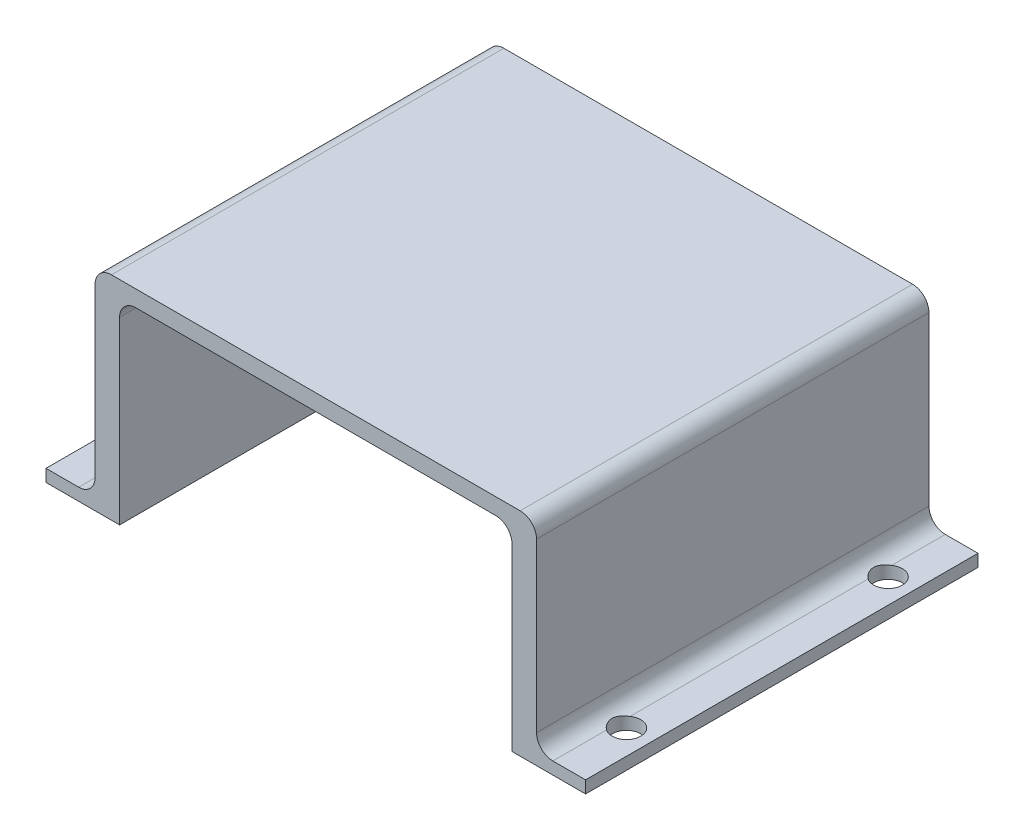
ISO-10303-21;
HEADER;
FILE_DESCRIPTION(('STEP AP214'),'2;1');
FILE_NAME('part.step','',(''),(''),'','','');
FILE_SCHEMA(('AUTOMOTIVE_DESIGN { 1 0 10303 214 1 1 1 1 }'));
ENDSEC;
DATA;
#1=APPLICATION_CONTEXT('core data for automotive mechanical design processes');
#2=APPLICATION_PROTOCOL_DEFINITION('international standard','automotive_design',2000,#1);
#3=PRODUCT_CONTEXT('',#1,'mechanical');
#4=PRODUCT('Part','Part','',(#3));
#5=PRODUCT_RELATED_PRODUCT_CATEGORY('part','',(#4));
#6=PRODUCT_DEFINITION_FORMATION('','',#4);
#7=PRODUCT_DEFINITION_CONTEXT('part definition',#1,'design');
#8=PRODUCT_DEFINITION('design','',#6,#7);
#9=PRODUCT_DEFINITION_SHAPE('','',#8);
#10=(LENGTH_UNIT() NAMED_UNIT(*) SI_UNIT(.MILLI.,.METRE.));
#11=(NAMED_UNIT(*) PLANE_ANGLE_UNIT() SI_UNIT($,.RADIAN.));
#12=(NAMED_UNIT(*) SI_UNIT($,.STERADIAN.) SOLID_ANGLE_UNIT());
#13=UNCERTAINTY_MEASURE_WITH_UNIT(LENGTH_MEASURE(1.E-05),#10,'distance_accuracy_value','');
#14=(GEOMETRIC_REPRESENTATION_CONTEXT(3) GLOBAL_UNCERTAINTY_ASSIGNED_CONTEXT((#13)) GLOBAL_UNIT_ASSIGNED_CONTEXT((#10,
#11,#12)) REPRESENTATION_CONTEXT('',''));
#15=CARTESIAN_POINT('',(0.,0.,0.));
#16=DIRECTION('',(0.,0.,1.));
#17=DIRECTION('',(1.,0.,0.));
#18=AXIS2_PLACEMENT_3D('',#15,#16,#17);
#19=CARTESIAN_POINT('',(0.,0.,76.2));
#20=DIRECTION('',(1.,0.,0.));
#21=DIRECTION('',(0.,0.,-1.));
#22=AXIS2_PLACEMENT_3D('',#19,#20,#21);
#23=PLANE('',#22);
#24=DIRECTION('',(0.,-1.,0.));
#25=VECTOR('',#24,1.);
#26=CARTESIAN_POINT('',(0.,0.,0.));
#27=LINE('',#26,#25);
#28=CARTESIAN_POINT('',(0.,2.38125,0.));
#29=VERTEX_POINT('',#28);
#30=CARTESIAN_POINT('',(0.,0.,0.));
#31=VERTEX_POINT('',#30);
#32=EDGE_CURVE('E345',#29,#31,#27,.T.);
#33=ORIENTED_EDGE('',*,*,#32,.T.);
#34=DIRECTION('',(0.,0.,-1.));
#35=VECTOR('',#34,1.);
#36=CARTESIAN_POINT('',(0.,0.,76.2));
#37=LINE('',#36,#35);
#38=CARTESIAN_POINT('',(0.,0.,76.2));
#39=VERTEX_POINT('',#38);
#40=EDGE_CURVE('E389',#39,#31,#37,.T.);
#41=ORIENTED_EDGE('',*,*,#40,.F.);
#42=DIRECTION('',(0.,-1.,0.));
#43=VECTOR('',#42,1.);
#44=CARTESIAN_POINT('',(0.,0.,76.2));
#45=LINE('',#44,#43);
#46=CARTESIAN_POINT('',(0.,2.38125,76.2));
#47=VERTEX_POINT('',#46);
#48=EDGE_CURVE('E376',#47,#39,#45,.T.);
#49=ORIENTED_EDGE('',*,*,#48,.F.);
#50=DIRECTION('',(0.,0.,-1.));
#51=VECTOR('',#50,1.);
#52=CARTESIAN_POINT('',(0.,2.38125,76.2));
#53=LINE('',#52,#51);
#54=EDGE_CURVE('E344',#47,#29,#53,.T.);
#55=ORIENTED_EDGE('',*,*,#54,.T.);
#56=EDGE_LOOP('',(#33,#41,#49,#55));
#57=FACE_BOUND('',#56,.T.);
#58=ADVANCED_FACE('F35',(#57),#23,.F.);
#59=CARTESIAN_POINT('',(0.,0.,76.2));
#60=DIRECTION('',(0.,1.,0.));
#61=DIRECTION('',(0.,0.,1.));
#62=AXIS2_PLACEMENT_3D('',#59,#60,#61);
#63=PLANE('',#62);
#64=CARTESIAN_POINT('',(4.7625,0.,12.7));
#65=DIRECTION('',(0.,1.,0.));
#66=DIRECTION('',(0.,0.,1.));
#67=AXIS2_PLACEMENT_3D('',#64,#65,#66);
#68=CIRCLE('',#67,2.778125);
#69=CARTESIAN_POINT('',(4.7625,0.,15.478125));
#70=VERTEX_POINT('',#69);
#71=EDGE_CURVE('E488',#70,#70,#68,.T.);
#72=ORIENTED_EDGE('',*,*,#71,.T.);
#73=EDGE_LOOP('',(#72));
#74=FACE_BOUND('',#73,.T.);
#75=CARTESIAN_POINT('',(4.7625,0.,63.5));
#76=DIRECTION('',(0.,1.,0.));
#77=DIRECTION('',(0.,0.,1.));
#78=AXIS2_PLACEMENT_3D('',#75,#76,#77);
#79=CIRCLE('',#78,2.778125);
#80=CARTESIAN_POINT('',(4.7625,0.,66.278125));
#81=VERTEX_POINT('',#80);
#82=EDGE_CURVE('E206',#81,#81,#79,.T.);
#83=ORIENTED_EDGE('',*,*,#82,.T.);
#84=EDGE_LOOP('',(#83));
#85=FACE_BOUND('',#84,.T.);
#86=DIRECTION('',(1.,0.,0.));
#87=VECTOR('',#86,1.);
#88=CARTESIAN_POINT('',(0.,0.,0.));
#89=LINE('',#88,#87);
#90=CARTESIAN_POINT('',(14.2875,0.,0.));
#91=VERTEX_POINT('',#90);
#92=EDGE_CURVE('E347',#31,#91,#89,.T.);
#93=ORIENTED_EDGE('',*,*,#92,.T.);
#94=DIRECTION('',(0.,0.,-1.));
#95=VECTOR('',#94,1.);
#96=CARTESIAN_POINT('',(14.2875,0.,76.2));
#97=LINE('',#96,#95);
#98=CARTESIAN_POINT('',(14.2875,0.,76.2));
#99=VERTEX_POINT('',#98);
#100=EDGE_CURVE('E386',#99,#91,#97,.T.);
#101=ORIENTED_EDGE('',*,*,#100,.F.);
#102=DIRECTION('',(1.,0.,0.));
#103=VECTOR('',#102,1.);
#104=CARTESIAN_POINT('',(0.,0.,76.2));
#105=LINE('',#104,#103);
#106=EDGE_CURVE('E478',#39,#99,#105,.T.);
#107=ORIENTED_EDGE('',*,*,#106,.F.);
#108=ORIENTED_EDGE('',*,*,#40,.T.);
#109=EDGE_LOOP('',(#93,#101,#107,#108));
#110=FACE_BOUND('',#109,.T.);
#111=ADVANCED_FACE('F281',(#74,#85,#110),#63,.F.);
#112=CARTESIAN_POINT('',(14.2875,0.,76.2));
#113=DIRECTION('',(-1.,0.,0.));
#114=DIRECTION('',(0.,0.,1.));
#115=AXIS2_PLACEMENT_3D('',#112,#113,#114);
#116=PLANE('',#115);
#117=DIRECTION('',(0.,1.,0.));
#118=VECTOR('',#117,1.);
#119=CARTESIAN_POINT('',(14.2875,0.,0.));
#120=LINE('',#119,#118);
#121=CARTESIAN_POINT('',(14.2875,34.925,0.));
#122=VERTEX_POINT('',#121);
#123=EDGE_CURVE('E350',#91,#122,#120,.T.);
#124=ORIENTED_EDGE('',*,*,#123,.T.);
#125=DIRECTION('',(0.,0.,-1.));
#126=VECTOR('',#125,1.);
#127=CARTESIAN_POINT('',(14.2875,34.925,76.2));
#128=LINE('',#127,#126);
#129=CARTESIAN_POINT('',(14.2875,34.925,76.2));
#130=VERTEX_POINT('',#129);
#131=EDGE_CURVE('E397',#122,#130,#128,.F.);
#132=ORIENTED_EDGE('',*,*,#131,.T.);
#133=DIRECTION('',(0.,1.,0.));
#134=VECTOR('',#133,1.);
#135=CARTESIAN_POINT('',(14.2875,0.,76.2));
#136=LINE('',#135,#134);
#137=EDGE_CURVE('E326',#99,#130,#136,.T.);
#138=ORIENTED_EDGE('',*,*,#137,.F.);
#139=ORIENTED_EDGE('',*,*,#100,.T.);
#140=EDGE_LOOP('',(#124,#132,#138,#139));
#141=FACE_BOUND('',#140,.T.);
#142=ADVANCED_FACE('F287',(#141),#116,.F.);
#143=CARTESIAN_POINT('',(14.2875,38.1,76.2));
#144=DIRECTION('',(0.,1.,0.));
#145=DIRECTION('',(0.,0.,1.));
#146=AXIS2_PLACEMENT_3D('',#143,#144,#145);
#147=PLANE('',#146);
#148=DIRECTION('',(1.,0.,0.));
#149=VECTOR('',#148,1.);
#150=CARTESIAN_POINT('',(14.2875,38.1,0.));
#151=LINE('',#150,#149);
#152=CARTESIAN_POINT('',(17.4625,38.1,0.));
#153=VERTEX_POINT('',#152);
#154=CARTESIAN_POINT('',(87.3125,38.1,0.));
#155=VERTEX_POINT('',#154);
#156=EDGE_CURVE('E353',#153,#155,#151,.T.);
#157=ORIENTED_EDGE('',*,*,#156,.T.);
#158=DIRECTION('',(0.,0.,-1.));
#159=VECTOR('',#158,1.);
#160=CARTESIAN_POINT('',(87.3125,38.1,76.2));
#161=LINE('',#160,#159);
#162=CARTESIAN_POINT('',(87.3125,38.1,76.2));
#163=VERTEX_POINT('',#162);
#164=EDGE_CURVE('E305',#155,#163,#161,.F.);
#165=ORIENTED_EDGE('',*,*,#164,.T.);
#166=DIRECTION('',(1.,0.,0.));
#167=VECTOR('',#166,1.);
#168=CARTESIAN_POINT('',(14.2875,38.1,76.2));
#169=LINE('',#168,#167);
#170=CARTESIAN_POINT('',(17.4625,38.1,76.2));
#171=VERTEX_POINT('',#170);
#172=EDGE_CURVE('E315',#171,#163,#169,.T.);
#173=ORIENTED_EDGE('',*,*,#172,.F.);
#174=DIRECTION('',(0.,0.,-1.));
#175=VECTOR('',#174,1.);
#176=CARTESIAN_POINT('',(17.4625,38.1,0.));
#177=LINE('',#176,#175);
#178=EDGE_CURVE('E393',#171,#153,#177,.T.);
#179=ORIENTED_EDGE('',*,*,#178,.T.);
#180=EDGE_LOOP('',(#157,#165,#173,#179));
#181=FACE_BOUND('',#180,.T.);
#182=ADVANCED_FACE('F457',(#181),#147,.F.);
#183=CARTESIAN_POINT('',(90.4875,38.1,76.2));
#184=DIRECTION('',(1.,0.,0.));
#185=DIRECTION('',(0.,1.,0.));
#186=AXIS2_PLACEMENT_3D('',#183,#184,#185);
#187=PLANE('',#186);
#188=DIRECTION('',(0.,-1.,0.));
#189=VECTOR('',#188,1.);
#190=CARTESIAN_POINT('',(90.4875,38.1,76.2));
#191=LINE('',#190,#189);
#192=CARTESIAN_POINT('',(90.4875,34.925,76.2));
#193=VERTEX_POINT('',#192);
#194=CARTESIAN_POINT('',(90.4875,0.,76.2));
#195=VERTEX_POINT('',#194);
#196=EDGE_CURVE('E312',#193,#195,#191,.T.);
#197=ORIENTED_EDGE('',*,*,#196,.F.);
#198=DIRECTION('',(0.,0.,-1.));
#199=VECTOR('',#198,1.);
#200=CARTESIAN_POINT('',(90.4875,34.925,0.));
#201=LINE('',#200,#199);
#202=CARTESIAN_POINT('',(90.4875,34.925,0.));
#203=VERTEX_POINT('',#202);
#204=EDGE_CURVE('E307',#193,#203,#201,.T.);
#205=ORIENTED_EDGE('',*,*,#204,.T.);
#206=DIRECTION('',(0.,-1.,0.));
#207=VECTOR('',#206,1.);
#208=CARTESIAN_POINT('',(90.4875,38.1,0.));
#209=LINE('',#208,#207);
#210=CARTESIAN_POINT('',(90.4875,0.,0.));
#211=VERTEX_POINT('',#210);
#212=EDGE_CURVE('E356',#203,#211,#209,.T.);
#213=ORIENTED_EDGE('',*,*,#212,.T.);
#214=DIRECTION('',(0.,0.,-1.));
#215=VECTOR('',#214,1.);
#216=CARTESIAN_POINT('',(90.4875,0.,76.2));
#217=LINE('',#216,#215);
#218=EDGE_CURVE('E320',#195,#211,#217,.T.);
#219=ORIENTED_EDGE('',*,*,#218,.F.);
#220=EDGE_LOOP('',(#197,#205,#213,#219));
#221=FACE_BOUND('',#220,.T.);
#222=ADVANCED_FACE('F317',(#221),#187,.F.);
#223=CARTESIAN_POINT('',(90.4875,0.,76.2));
#224=DIRECTION('',(0.,1.,0.));
#225=DIRECTION('',(-1.,0.,0.));
#226=AXIS2_PLACEMENT_3D('',#223,#224,#225);
#227=PLANE('',#226);
#228=CARTESIAN_POINT('',(100.0125,0.,63.5));
#229=DIRECTION('',(0.,1.,0.));
#230=DIRECTION('',(-1.,0.,0.));
#231=AXIS2_PLACEMENT_3D('',#228,#229,#230);
#232=CIRCLE('',#231,2.778125);
#233=CARTESIAN_POINT('',(97.234375,0.,63.5));
#234=VERTEX_POINT('',#233);
#235=EDGE_CURVE('E348',#234,#234,#232,.T.);
#236=ORIENTED_EDGE('',*,*,#235,.T.);
#237=EDGE_LOOP('',(#236));
#238=FACE_BOUND('',#237,.T.);
#239=CARTESIAN_POINT('',(100.0125,0.,12.7));
#240=DIRECTION('',(0.,1.,0.));
#241=DIRECTION('',(-1.,0.,0.));
#242=AXIS2_PLACEMENT_3D('',#239,#240,#241);
#243=CIRCLE('',#242,2.778125);
#244=CARTESIAN_POINT('',(97.234375,0.,12.7));
#245=VERTEX_POINT('',#244);
#246=EDGE_CURVE('E484',#245,#245,#243,.T.);
#247=ORIENTED_EDGE('',*,*,#246,.T.);
#248=EDGE_LOOP('',(#247));
#249=FACE_BOUND('',#248,.T.);
#250=DIRECTION('',(1.,0.,0.));
#251=VECTOR('',#250,1.);
#252=CARTESIAN_POINT('',(90.4875,0.,0.));
#253=LINE('',#252,#251);
#254=CARTESIAN_POINT('',(104.775,0.,0.));
#255=VERTEX_POINT('',#254);
#256=EDGE_CURVE('E358',#211,#255,#253,.T.);
#257=ORIENTED_EDGE('',*,*,#256,.T.);
#258=DIRECTION('',(0.,0.,-1.));
#259=VECTOR('',#258,1.);
#260=CARTESIAN_POINT('',(104.775,0.,76.2));
#261=LINE('',#260,#259);
#262=CARTESIAN_POINT('',(104.775,0.,76.2));
#263=VERTEX_POINT('',#262);
#264=EDGE_CURVE('E382',#263,#255,#261,.T.);
#265=ORIENTED_EDGE('',*,*,#264,.F.);
#266=DIRECTION('',(1.,0.,0.));
#267=VECTOR('',#266,1.);
#268=CARTESIAN_POINT('',(90.4875,0.,76.2));
#269=LINE('',#268,#267);
#270=EDGE_CURVE('E322',#195,#263,#269,.T.);
#271=ORIENTED_EDGE('',*,*,#270,.F.);
#272=ORIENTED_EDGE('',*,*,#218,.T.);
#273=EDGE_LOOP('',(#257,#265,#271,#272));
#274=FACE_BOUND('',#273,.T.);
#275=ADVANCED_FACE('F448',(#238,#249,#274),#227,.F.);
#276=CARTESIAN_POINT('',(104.775,0.,76.2));
#277=DIRECTION('',(-1.,0.,0.));
#278=DIRECTION('',(0.,0.,1.));
#279=AXIS2_PLACEMENT_3D('',#276,#277,#278);
#280=PLANE('',#279);
#281=DIRECTION('',(0.,1.,0.));
#282=VECTOR('',#281,1.);
#283=CARTESIAN_POINT('',(104.775,0.,0.));
#284=LINE('',#283,#282);
#285=CARTESIAN_POINT('',(104.775,2.38125,0.));
#286=VERTEX_POINT('',#285);
#287=EDGE_CURVE('E360',#255,#286,#284,.T.);
#288=ORIENTED_EDGE('',*,*,#287,.T.);
#289=DIRECTION('',(0.,0.,-1.));
#290=VECTOR('',#289,1.);
#291=CARTESIAN_POINT('',(104.775,2.38125,76.2));
#292=LINE('',#291,#290);
#293=CARTESIAN_POINT('',(104.775,2.38125,76.2));
#294=VERTEX_POINT('',#293);
#295=EDGE_CURVE('E379',#294,#286,#292,.T.);
#296=ORIENTED_EDGE('',*,*,#295,.F.);
#297=DIRECTION('',(0.,1.,0.));
#298=VECTOR('',#297,1.);
#299=CARTESIAN_POINT('',(104.775,0.,76.2));
#300=LINE('',#299,#298);
#301=EDGE_CURVE('E324',#263,#294,#300,.T.);
#302=ORIENTED_EDGE('',*,*,#301,.F.);
#303=ORIENTED_EDGE('',*,*,#264,.T.);
#304=EDGE_LOOP('',(#288,#296,#302,#303));
#305=FACE_BOUND('',#304,.T.);
#306=ADVANCED_FACE('F444',(#305),#280,.F.);
#307=CARTESIAN_POINT('',(104.775,2.38125,76.2));
#308=DIRECTION('',(0.,-1.,0.));
#309=DIRECTION('',(1.,0.,0.));
#310=AXIS2_PLACEMENT_3D('',#307,#308,#309);
#311=PLANE('',#310);
#312=DIRECTION('',(0.,0.,-1.));
#313=VECTOR('',#312,1.);
#314=CARTESIAN_POINT('',(98.425,2.38125,76.2));
#315=LINE('',#314,#313);
#316=CARTESIAN_POINT('',(98.425,2.38125,14.9798733003448));
#317=VERTEX_POINT('',#316);
#318=CARTESIAN_POINT('',(98.425,2.38125,61.2201266996552));
#319=VERTEX_POINT('',#318);
#320=EDGE_CURVE('E409',#317,#319,#315,.F.);
#321=ORIENTED_EDGE('',*,*,#320,.T.);
#322=CARTESIAN_POINT('',(100.0125,2.38125,63.5));
#323=DIRECTION('',(0.,-1.,0.));
#324=DIRECTION('',(1.,0.,0.));
#325=AXIS2_PLACEMENT_3D('',#322,#323,#324);
#326=CIRCLE('',#325,2.778125);
#327=CARTESIAN_POINT('',(98.425,2.38125,65.7798733003448));
#328=VERTEX_POINT('',#327);
#329=EDGE_CURVE('E54',#319,#328,#326,.T.);
#330=ORIENTED_EDGE('',*,*,#329,.T.);
#331=CARTESIAN_POINT('',(98.425,2.38125,76.2));
#332=VERTEX_POINT('',#331);
#333=EDGE_CURVE('E404',#328,#332,#315,.F.);
#334=ORIENTED_EDGE('',*,*,#333,.T.);
#335=DIRECTION('',(-1.,0.,0.));
#336=VECTOR('',#335,1.);
#337=CARTESIAN_POINT('',(104.775,2.38125,76.2));
#338=LINE('',#337,#336);
#339=EDGE_CURVE('E331',#294,#332,#338,.T.);
#340=ORIENTED_EDGE('',*,*,#339,.F.);
#341=ORIENTED_EDGE('',*,*,#295,.T.);
#342=DIRECTION('',(-1.,0.,0.));
#343=VECTOR('',#342,1.);
#344=CARTESIAN_POINT('',(104.775,2.38125,0.));
#345=LINE('',#344,#343);
#346=CARTESIAN_POINT('',(98.425,2.38125,0.));
#347=VERTEX_POINT('',#346);
#348=EDGE_CURVE('E362',#286,#347,#345,.T.);
#349=ORIENTED_EDGE('',*,*,#348,.T.);
#350=CARTESIAN_POINT('',(98.425,2.38125,10.4201266996552));
#351=VERTEX_POINT('',#350);
#352=EDGE_CURVE('E405',#347,#351,#315,.F.);
#353=ORIENTED_EDGE('',*,*,#352,.T.);
#354=CARTESIAN_POINT('',(100.0125,2.38125,12.7));
#355=DIRECTION('',(0.,-1.,0.));
#356=DIRECTION('',(1.,0.,0.));
#357=AXIS2_PLACEMENT_3D('',#354,#355,#356);
#358=CIRCLE('',#357,2.778125);
#359=EDGE_CURVE('E60',#351,#317,#358,.T.);
#360=ORIENTED_EDGE('',*,*,#359,.T.);
#361=EDGE_LOOP('',(#321,#330,#334,#340,#341,#349,#353,#360));
#362=FACE_BOUND('',#361,.T.);
#363=ADVANCED_FACE('F439',(#362),#311,.F.);
#364=CARTESIAN_POINT('',(95.25,2.38125,76.2));
#365=DIRECTION('',(-1.,0.,0.));
#366=DIRECTION('',(0.,0.,1.));
#367=AXIS2_PLACEMENT_3D('',#364,#365,#366);
#368=PLANE('',#367);
#369=DIRECTION('',(0.,1.,0.));
#370=VECTOR('',#369,1.);
#371=CARTESIAN_POINT('',(95.25,2.38125,76.2));
#372=LINE('',#371,#370);
#373=CARTESIAN_POINT('',(95.25,5.55625,76.2));
#374=VERTEX_POINT('',#373);
#375=CARTESIAN_POINT('',(95.25,38.1,76.2));
#376=VERTEX_POINT('',#375);
#377=EDGE_CURVE('E334',#374,#376,#372,.T.);
#378=ORIENTED_EDGE('',*,*,#377,.F.);
#379=DIRECTION('',(0.,0.,-1.));
#380=VECTOR('',#379,1.);
#381=CARTESIAN_POINT('',(95.25,5.55625,0.));
#382=LINE('',#381,#380);
#383=CARTESIAN_POINT('',(95.25,5.55625,0.));
#384=VERTEX_POINT('',#383);
#385=EDGE_CURVE('E401',#374,#384,#382,.T.);
#386=ORIENTED_EDGE('',*,*,#385,.T.);
#387=DIRECTION('',(0.,1.,0.));
#388=VECTOR('',#387,1.);
#389=CARTESIAN_POINT('',(95.25,2.38125,0.));
#390=LINE('',#389,#388);
#391=CARTESIAN_POINT('',(95.25,38.1,0.));
#392=VERTEX_POINT('',#391);
#393=EDGE_CURVE('E365',#384,#392,#390,.T.);
#394=ORIENTED_EDGE('',*,*,#393,.T.);
#395=DIRECTION('',(0.,0.,-1.));
#396=VECTOR('',#395,1.);
#397=CARTESIAN_POINT('',(95.25,38.1,76.2));
#398=LINE('',#397,#396);
#399=EDGE_CURVE('E399',#392,#376,#398,.F.);
#400=ORIENTED_EDGE('',*,*,#399,.T.);
#401=EDGE_LOOP('',(#378,#386,#394,#400));
#402=FACE_BOUND('',#401,.T.);
#403=ADVANCED_FACE('F430',(#402),#368,.F.);
#404=CARTESIAN_POINT('',(95.25,41.275,76.2));
#405=DIRECTION('',(0.,-1.,0.));
#406=DIRECTION('',(1.,0.,0.));
#407=AXIS2_PLACEMENT_3D('',#404,#405,#406);
#408=PLANE('',#407);
#409=DIRECTION('',(-1.,0.,0.));
#410=VECTOR('',#409,1.);
#411=CARTESIAN_POINT('',(95.25,41.275,76.2));
#412=LINE('',#411,#410);
#413=CARTESIAN_POINT('',(92.075,41.275,76.2));
#414=VERTEX_POINT('',#413);
#415=CARTESIAN_POINT('',(12.7,41.275,76.2));
#416=VERTEX_POINT('',#415);
#417=EDGE_CURVE('E336',#414,#416,#412,.T.);
#418=ORIENTED_EDGE('',*,*,#417,.F.);
#419=DIRECTION('',(0.,0.,-1.));
#420=VECTOR('',#419,1.);
#421=CARTESIAN_POINT('',(92.075,41.275,76.2));
#422=LINE('',#421,#420);
#423=CARTESIAN_POINT('',(92.075,41.275,0.));
#424=VERTEX_POINT('',#423);
#425=EDGE_CURVE('E411',#414,#424,#422,.T.);
#426=ORIENTED_EDGE('',*,*,#425,.T.);
#427=DIRECTION('',(-1.,0.,0.));
#428=VECTOR('',#427,1.);
#429=CARTESIAN_POINT('',(95.25,41.275,0.));
#430=LINE('',#429,#428);
#431=CARTESIAN_POINT('',(12.7,41.275,0.));
#432=VERTEX_POINT('',#431);
#433=EDGE_CURVE('E368',#424,#432,#430,.T.);
#434=ORIENTED_EDGE('',*,*,#433,.T.);
#435=DIRECTION('',(0.,0.,-1.));
#436=VECTOR('',#435,1.);
#437=CARTESIAN_POINT('',(12.7,41.275,76.2));
#438=LINE('',#437,#436);
#439=EDGE_CURVE('E408',#432,#416,#438,.F.);
#440=ORIENTED_EDGE('',*,*,#439,.T.);
#441=EDGE_LOOP('',(#418,#426,#434,#440));
#442=FACE_BOUND('',#441,.T.);
#443=ADVANCED_FACE('F425',(#442),#408,.F.);
#444=CARTESIAN_POINT('',(9.525,41.275,76.2));
#445=DIRECTION('',(1.,0.,0.));
#446=DIRECTION('',(0.,1.,0.));
#447=AXIS2_PLACEMENT_3D('',#444,#445,#446);
#448=PLANE('',#447);
#449=DIRECTION('',(0.,-1.,0.));
#450=VECTOR('',#449,1.);
#451=CARTESIAN_POINT('',(9.525,41.275,0.));
#452=LINE('',#451,#450);
#453=CARTESIAN_POINT('',(9.525,38.1,0.));
#454=VERTEX_POINT('',#453);
#455=CARTESIAN_POINT('',(9.525,5.55625,0.));
#456=VERTEX_POINT('',#455);
#457=EDGE_CURVE('E371',#454,#456,#452,.T.);
#458=ORIENTED_EDGE('',*,*,#457,.T.);
#459=DIRECTION('',(0.,0.,-1.));
#460=VECTOR('',#459,1.);
#461=CARTESIAN_POINT('',(9.525,5.55625,76.2));
#462=LINE('',#461,#460);
#463=CARTESIAN_POINT('',(9.525,5.55625,76.2));
#464=VERTEX_POINT('',#463);
#465=EDGE_CURVE('E220',#456,#464,#462,.F.);
#466=ORIENTED_EDGE('',*,*,#465,.T.);
#467=DIRECTION('',(0.,-1.,0.));
#468=VECTOR('',#467,1.);
#469=CARTESIAN_POINT('',(9.525,41.275,76.2));
#470=LINE('',#469,#468);
#471=CARTESIAN_POINT('',(9.525,38.1,76.2));
#472=VERTEX_POINT('',#471);
#473=EDGE_CURVE('E339',#472,#464,#470,.T.);
#474=ORIENTED_EDGE('',*,*,#473,.F.);
#475=DIRECTION('',(0.,0.,-1.));
#476=VECTOR('',#475,1.);
#477=CARTESIAN_POINT('',(9.525,38.1,76.2));
#478=LINE('',#477,#476);
#479=EDGE_CURVE('E213',#472,#454,#478,.T.);
#480=ORIENTED_EDGE('',*,*,#479,.T.);
#481=EDGE_LOOP('',(#458,#466,#474,#480));
#482=FACE_BOUND('',#481,.T.);
#483=ADVANCED_FACE('F507',(#482),#448,.F.);
#484=CARTESIAN_POINT('',(0.,2.38125,76.2));
#485=DIRECTION('',(0.,-1.,0.));
#486=DIRECTION('',(0.,0.,-1.));
#487=AXIS2_PLACEMENT_3D('',#484,#485,#486);
#488=PLANE('',#487);
#489=DIRECTION('',(0.,0.,-1.));
#490=VECTOR('',#489,1.);
#491=CARTESIAN_POINT('',(6.35,2.38125,0.));
#492=LINE('',#491,#490);
#493=CARTESIAN_POINT('',(6.35,2.38125,61.2201266996552));
#494=VERTEX_POINT('',#493);
#495=CARTESIAN_POINT('',(6.35,2.38125,14.9798733003448));
#496=VERTEX_POINT('',#495);
#497=EDGE_CURVE('E203',#494,#496,#492,.T.);
#498=ORIENTED_EDGE('',*,*,#497,.T.);
#499=CARTESIAN_POINT('',(4.7625,2.38125,12.7));
#500=DIRECTION('',(0.,-1.,0.));
#501=DIRECTION('',(0.,0.,-1.));
#502=AXIS2_PLACEMENT_3D('',#499,#500,#501);
#503=CIRCLE('',#502,2.778125);
#504=CARTESIAN_POINT('',(6.35,2.38125,10.4201266996552));
#505=VERTEX_POINT('',#504);
#506=EDGE_CURVE('E491',#496,#505,#503,.T.);
#507=ORIENTED_EDGE('',*,*,#506,.T.);
#508=CARTESIAN_POINT('',(6.35,2.38125,0.));
#509=VERTEX_POINT('',#508);
#510=EDGE_CURVE('E211',#505,#509,#492,.T.);
#511=ORIENTED_EDGE('',*,*,#510,.T.);
#512=DIRECTION('',(-1.,0.,0.));
#513=VECTOR('',#512,1.);
#514=CARTESIAN_POINT('',(0.,2.38125,0.));
#515=LINE('',#514,#513);
#516=EDGE_CURVE('E374',#509,#29,#515,.T.);
#517=ORIENTED_EDGE('',*,*,#516,.T.);
#518=ORIENTED_EDGE('',*,*,#54,.F.);
#519=DIRECTION('',(-1.,0.,0.));
#520=VECTOR('',#519,1.);
#521=CARTESIAN_POINT('',(0.,2.38125,76.2));
#522=LINE('',#521,#520);
#523=CARTESIAN_POINT('',(6.35,2.38125,76.2));
#524=VERTEX_POINT('',#523);
#525=EDGE_CURVE('E342',#524,#47,#522,.T.);
#526=ORIENTED_EDGE('',*,*,#525,.F.);
#527=CARTESIAN_POINT('',(6.35,2.38125,65.7798733003448));
#528=VERTEX_POINT('',#527);
#529=EDGE_CURVE('E205',#524,#528,#492,.T.);
#530=ORIENTED_EDGE('',*,*,#529,.T.);
#531=CARTESIAN_POINT('',(4.7625,2.38125,63.5));
#532=DIRECTION('',(0.,-1.,0.));
#533=DIRECTION('',(0.,0.,-1.));
#534=AXIS2_PLACEMENT_3D('',#531,#532,#533);
#535=CIRCLE('',#534,2.778125);
#536=EDGE_CURVE('E191',#528,#494,#535,.T.);
#537=ORIENTED_EDGE('',*,*,#536,.T.);
#538=EDGE_LOOP('',(#498,#507,#511,#517,#518,#526,#530,#537));
#539=FACE_BOUND('',#538,.T.);
#540=ADVANCED_FACE('F201',(#539),#488,.F.);
#541=CARTESIAN_POINT('',(0.,0.,76.2));
#542=DIRECTION('',(0.,0.,-1.));
#543=DIRECTION('',(-1.,0.,0.));
#544=AXIS2_PLACEMENT_3D('',#541,#542,#543);
#545=PLANE('',#544);
#546=ORIENTED_EDGE('',*,*,#377,.T.);
#547=CARTESIAN_POINT('',(92.075,38.1,76.2));
#548=DIRECTION('',(0.,0.,-1.));
#549=DIRECTION('',(-1.,0.,0.));
#550=AXIS2_PLACEMENT_3D('',#547,#548,#549);
#551=CIRCLE('',#550,3.175);
#552=EDGE_CURVE('E214',#376,#414,#551,.F.);
#553=ORIENTED_EDGE('',*,*,#552,.T.);
#554=ORIENTED_EDGE('',*,*,#417,.T.);
#555=CARTESIAN_POINT('',(12.7,38.1,76.2));
#556=DIRECTION('',(0.,0.,-1.));
#557=DIRECTION('',(-1.,0.,0.));
#558=AXIS2_PLACEMENT_3D('',#555,#556,#557);
#559=CIRCLE('',#558,3.175);
#560=EDGE_CURVE('E417',#416,#472,#559,.F.);
#561=ORIENTED_EDGE('',*,*,#560,.T.);
#562=ORIENTED_EDGE('',*,*,#473,.T.);
#563=CARTESIAN_POINT('',(6.35,5.55625,76.2));
#564=DIRECTION('',(0.,0.,-1.));
#565=DIRECTION('',(-1.,0.,0.));
#566=AXIS2_PLACEMENT_3D('',#563,#564,#565);
#567=CIRCLE('',#566,3.175);
#568=EDGE_CURVE('E197',#464,#524,#567,.T.);
#569=ORIENTED_EDGE('',*,*,#568,.T.);
#570=ORIENTED_EDGE('',*,*,#525,.T.);
#571=ORIENTED_EDGE('',*,*,#48,.T.);
#572=ORIENTED_EDGE('',*,*,#106,.T.);
#573=ORIENTED_EDGE('',*,*,#137,.T.);
#574=CARTESIAN_POINT('',(17.4625,34.925,76.2));
#575=DIRECTION('',(0.,0.,-1.));
#576=DIRECTION('',(-1.,0.,0.));
#577=AXIS2_PLACEMENT_3D('',#574,#575,#576);
#578=CIRCLE('',#577,3.175);
#579=EDGE_CURVE('E228',#130,#171,#578,.T.);
#580=ORIENTED_EDGE('',*,*,#579,.T.);
#581=ORIENTED_EDGE('',*,*,#172,.T.);
#582=CARTESIAN_POINT('',(87.3125,34.925,76.2));
#583=DIRECTION('',(0.,0.,-1.));
#584=DIRECTION('',(-1.,0.,0.));
#585=AXIS2_PLACEMENT_3D('',#582,#583,#584);
#586=CIRCLE('',#585,3.175);
#587=EDGE_CURVE('E224',#163,#193,#586,.T.);
#588=ORIENTED_EDGE('',*,*,#587,.T.);
#589=ORIENTED_EDGE('',*,*,#196,.T.);
#590=ORIENTED_EDGE('',*,*,#270,.T.);
#591=ORIENTED_EDGE('',*,*,#301,.T.);
#592=ORIENTED_EDGE('',*,*,#339,.T.);
#593=CARTESIAN_POINT('',(98.425,5.55625,76.2));
#594=DIRECTION('',(0.,0.,-1.));
#595=DIRECTION('',(-1.,0.,0.));
#596=AXIS2_PLACEMENT_3D('',#593,#594,#595);
#597=CIRCLE('',#596,3.175);
#598=EDGE_CURVE('E232',#332,#374,#597,.T.);
#599=ORIENTED_EDGE('',*,*,#598,.T.);
#600=EDGE_LOOP('',(#546,#553,#554,#561,#562,#569,#570,#571,#572,#573,#580,#581,#588,#589,#590,
#591,#592,#599));
#601=FACE_BOUND('',#600,.T.);
#602=ADVANCED_FACE('F260',(#601),#545,.F.);
#603=CARTESIAN_POINT('',(0.,0.,0.));
#604=DIRECTION('',(0.,0.,-1.));
#605=DIRECTION('',(-1.,0.,0.));
#606=AXIS2_PLACEMENT_3D('',#603,#604,#605);
#607=PLANE('',#606);
#608=ORIENTED_EDGE('',*,*,#433,.F.);
#609=CARTESIAN_POINT('',(92.075,38.1,0.));
#610=DIRECTION('',(0.,0.,-1.));
#611=DIRECTION('',(-1.,0.,0.));
#612=AXIS2_PLACEMENT_3D('',#609,#610,#611);
#613=CIRCLE('',#612,3.175);
#614=EDGE_CURVE('E416',#424,#392,#613,.T.);
#615=ORIENTED_EDGE('',*,*,#614,.T.);
#616=ORIENTED_EDGE('',*,*,#393,.F.);
#617=CARTESIAN_POINT('',(98.425,5.55625,0.));
#618=DIRECTION('',(0.,0.,-1.));
#619=DIRECTION('',(-1.,0.,0.));
#620=AXIS2_PLACEMENT_3D('',#617,#618,#619);
#621=CIRCLE('',#620,3.175);
#622=EDGE_CURVE('E230',#384,#347,#621,.F.);
#623=ORIENTED_EDGE('',*,*,#622,.T.);
#624=ORIENTED_EDGE('',*,*,#348,.F.);
#625=ORIENTED_EDGE('',*,*,#287,.F.);
#626=ORIENTED_EDGE('',*,*,#256,.F.);
#627=ORIENTED_EDGE('',*,*,#212,.F.);
#628=CARTESIAN_POINT('',(87.3125,34.925,0.));
#629=DIRECTION('',(0.,0.,-1.));
#630=DIRECTION('',(-1.,0.,0.));
#631=AXIS2_PLACEMENT_3D('',#628,#629,#630);
#632=CIRCLE('',#631,3.175);
#633=EDGE_CURVE('E222',#203,#155,#632,.F.);
#634=ORIENTED_EDGE('',*,*,#633,.T.);
#635=ORIENTED_EDGE('',*,*,#156,.F.);
#636=CARTESIAN_POINT('',(17.4625,34.925,0.));
#637=DIRECTION('',(0.,0.,-1.));
#638=DIRECTION('',(-1.,0.,0.));
#639=AXIS2_PLACEMENT_3D('',#636,#637,#638);
#640=CIRCLE('',#639,3.175);
#641=EDGE_CURVE('E226',#153,#122,#640,.F.);
#642=ORIENTED_EDGE('',*,*,#641,.T.);
#643=ORIENTED_EDGE('',*,*,#123,.F.);
#644=ORIENTED_EDGE('',*,*,#92,.F.);
#645=ORIENTED_EDGE('',*,*,#32,.F.);
#646=ORIENTED_EDGE('',*,*,#516,.F.);
#647=CARTESIAN_POINT('',(6.35,5.55625,0.));
#648=DIRECTION('',(0.,0.,-1.));
#649=DIRECTION('',(-1.,0.,0.));
#650=AXIS2_PLACEMENT_3D('',#647,#648,#649);
#651=CIRCLE('',#650,3.175);
#652=EDGE_CURVE('E234',#509,#456,#651,.F.);
#653=ORIENTED_EDGE('',*,*,#652,.T.);
#654=ORIENTED_EDGE('',*,*,#457,.F.);
#655=CARTESIAN_POINT('',(12.7,38.1,0.));
#656=DIRECTION('',(0.,0.,-1.));
#657=DIRECTION('',(-1.,0.,0.));
#658=AXIS2_PLACEMENT_3D('',#655,#656,#657);
#659=CIRCLE('',#658,3.175);
#660=EDGE_CURVE('E414',#454,#432,#659,.T.);
#661=ORIENTED_EDGE('',*,*,#660,.T.);
#662=EDGE_LOOP('',(#608,#615,#616,#623,#624,#625,#626,#627,#634,#635,#642,#643,#644,#645,#646,
#653,#654,#661));
#663=FACE_BOUND('',#662,.T.);
#664=ADVANCED_FACE('F294',(#663),#607,.T.);
#665=CARTESIAN_POINT('',(87.3125,34.925,76.2));
#666=DIRECTION('',(0.,0.,1.));
#667=DIRECTION('',(1.,0.,0.));
#668=AXIS2_PLACEMENT_3D('',#665,#666,#667);
#669=CYLINDRICAL_SURFACE('',#668,3.175);
#670=ORIENTED_EDGE('',*,*,#587,.F.);
#671=ORIENTED_EDGE('',*,*,#164,.F.);
#672=ORIENTED_EDGE('',*,*,#633,.F.);
#673=ORIENTED_EDGE('',*,*,#204,.F.);
#674=EDGE_LOOP('',(#670,#671,#672,#673));
#675=FACE_BOUND('',#674,.T.);
#676=ADVANCED_FACE('F292',(#675),#669,.F.);
#677=CARTESIAN_POINT('',(17.4625,34.925,76.2));
#678=DIRECTION('',(0.,0.,1.));
#679=DIRECTION('',(1.,0.,0.));
#680=AXIS2_PLACEMENT_3D('',#677,#678,#679);
#681=CYLINDRICAL_SURFACE('',#680,3.175);
#682=ORIENTED_EDGE('',*,*,#579,.F.);
#683=ORIENTED_EDGE('',*,*,#131,.F.);
#684=ORIENTED_EDGE('',*,*,#641,.F.);
#685=ORIENTED_EDGE('',*,*,#178,.F.);
#686=EDGE_LOOP('',(#682,#683,#684,#685));
#687=FACE_BOUND('',#686,.T.);
#688=ADVANCED_FACE('F270',(#687),#681,.F.);
#689=CARTESIAN_POINT('',(98.425,5.55625,76.2));
#690=DIRECTION('',(0.,0.,1.));
#691=DIRECTION('',(1.,0.,0.));
#692=AXIS2_PLACEMENT_3D('',#689,#690,#691);
#693=CYLINDRICAL_SURFACE('',#692,3.175);
#694=ORIENTED_EDGE('',*,*,#333,.F.);
#695=CARTESIAN_POINT('',(98.425,2.38125,65.7798733003448));
#696=CARTESIAN_POINT('',(98.3624489926485,2.38124502199424,65.7363321245006));
#697=CARTESIAN_POINT('',(98.3017322303486,2.38309804994742,65.6902197109771));
#698=CARTESIAN_POINT('',(98.184432268252,2.38983384564999,65.5933018999807));
#699=CARTESIAN_POINT('',(98.1278454163736,2.39471389940968,65.5425007410642));
#700=CARTESIAN_POINT('',(98.0193024207807,2.4068037016709,65.4367173582443));
#701=CARTESIAN_POINT('',(97.96733428063,2.41400717558616,65.3817466968207));
#702=CARTESIAN_POINT('',(97.868154933093,2.43005858086851,65.2678989621292));
#703=CARTESIAN_POINT('',(97.8209447793166,2.43890687523668,65.2090210283998));
#704=CARTESIAN_POINT('',(97.6871038219786,2.46684469491917,65.0274352741283));
#705=CARTESIAN_POINT('',(97.607869365919,2.4873803235839,64.8993906703489));
#706=CARTESIAN_POINT('',(97.4709860036099,2.52712437069266,64.6319266454302));
#707=CARTESIAN_POINT('',(97.4133510617319,2.54633192399795,64.4924999362921));
#708=CARTESIAN_POINT('',(97.3432231507197,2.57111677931778,64.2740587545186));
#709=CARTESIAN_POINT('',(97.3223053782528,2.57882815850023,64.1979090980219));
#710=CARTESIAN_POINT('',(97.287002191366,2.59214026859064,64.0439401548763));
#711=CARTESIAN_POINT('',(97.2726142449898,2.59774181744702,63.9661215276538));
#712=CARTESIAN_POINT('',(97.2505303487237,2.60643829314347,63.8094435279201));
#713=CARTESIAN_POINT('',(97.2428305209971,2.60953467243392,63.7305847854429));
#714=CARTESIAN_POINT('',(97.2341899512417,2.6130189641069,63.5724617797592));
#715=CARTESIAN_POINT('',(97.2332487369621,2.61340706572734,63.4931975452733));
#716=CARTESIAN_POINT('',(97.2402893399155,2.61054497764216,63.2663190805623));
#717=CARTESIAN_POINT('',(97.2566972011995,2.60385589732818,63.1189116366899));
#718=CARTESIAN_POINT('',(97.3125372779258,2.58237980045341,62.8291678683077));
#719=CARTESIAN_POINT('',(97.3519853509499,2.56758720703055,62.6868351081414));
#720=CARTESIAN_POINT('',(97.4529618762006,2.53323589966773,62.4097563475591));
#721=CARTESIAN_POINT('',(97.5146394412628,2.51364529266191,62.2750688681231));
#722=CARTESIAN_POINT('',(97.6584863018631,2.47426551584966,62.0173066659403));
#723=CARTESIAN_POINT('',(97.7406400907546,2.45447650712785,61.8942232522086));
#724=CARTESIAN_POINT('',(97.9162497356903,2.42111298992168,61.671874415548));
#725=CARTESIAN_POINT('',(98.0081904103072,2.40715770025353,61.5714785335799));
#726=CARTESIAN_POINT('',(98.1567625689363,2.39220791436953,61.4314561310547));
#727=CARTESIAN_POINT('',(98.2081400706107,2.38822052151454,61.3864903738157));
#728=CARTESIAN_POINT('',(98.3141816518071,2.38273968490741,61.3003716788447));
#729=CARTESIAN_POINT('',(98.3688481381899,2.38124809114062,61.2592215907599));
#730=CARTESIAN_POINT('',(98.425,2.38125,61.2201266996552));
#731=B_SPLINE_CURVE_WITH_KNOTS('',3,(#695,#696,#697,#698,#699,#700,#701,#702,#703,#704,#705,
#706,#707,#708,#709,#710,#711,#712,#713,#714,#715,#716,#717,#718,#719,#720,#721,#722,#723,#724,
#725,#726,#727,#728,#729,#730),.UNSPECIFIED.,.F.,.F.,(4,2,2,2,2,2,2,2,2,2,2,2,2,2,2,2,2,4),(0.,
0.22849924185729,0.45679390997516,0.68447714047554,0.912210678955064,1.36603972488336,
1.82016167319418,2.05793150218368,2.29560905639513,2.53314871066593,2.77067176695067,
3.21372839170438,3.65709031311518,4.10348336138239,4.54953937785754,4.95837357214384,
5.16334481479638,5.36846792307332),.UNSPECIFIED.);
#732=EDGE_CURVE('E11',#328,#319,#731,.T.);
#733=ORIENTED_EDGE('',*,*,#732,.T.);
#734=ORIENTED_EDGE('',*,*,#320,.F.);
#735=CARTESIAN_POINT('',(98.425,2.38125,14.9798733003448));
#736=CARTESIAN_POINT('',(98.3624489926485,2.38124502199424,14.9363321245006));
#737=CARTESIAN_POINT('',(98.3017322303486,2.38309804994742,14.8902197109771));
#738=CARTESIAN_POINT('',(98.184432268252,2.38983384564999,14.7933018999807));
#739=CARTESIAN_POINT('',(98.1278454163737,2.39471389940968,14.7425007410643));
#740=CARTESIAN_POINT('',(98.0193024207807,2.4068037016709,14.6367173582443));
#741=CARTESIAN_POINT('',(97.9673342806301,2.41400717558616,14.5817466968207));
#742=CARTESIAN_POINT('',(97.868154933093,2.43005858086851,14.4678989621292));
#743=CARTESIAN_POINT('',(97.8209447793167,2.43890687523668,14.4090210283998));
#744=CARTESIAN_POINT('',(97.6871038219786,2.46684469491917,14.2274352741284));
#745=CARTESIAN_POINT('',(97.607869365919,2.48738032358389,14.0993906703489));
#746=CARTESIAN_POINT('',(97.4709860036099,2.52712437069265,13.8319266454302));
#747=CARTESIAN_POINT('',(97.4133510617319,2.54633192399795,13.6924999362921));
#748=CARTESIAN_POINT('',(97.3432231507198,2.57111677931778,13.4740587545186));
#749=CARTESIAN_POINT('',(97.3223053782528,2.57882815850023,13.397909098022));
#750=CARTESIAN_POINT('',(97.287002191366,2.59214026859064,13.2439401548764));
#751=CARTESIAN_POINT('',(97.2726142449898,2.59774181744702,13.1661215276538));
#752=CARTESIAN_POINT('',(97.2505303487237,2.60643829314347,13.0094435279201));
#753=CARTESIAN_POINT('',(97.2428305209971,2.60953467243391,12.9305847854429));
#754=CARTESIAN_POINT('',(97.2341899512417,2.6130189641069,12.7724617797592));
#755=CARTESIAN_POINT('',(97.2332487369621,2.61340706572734,12.6931975452733));
#756=CARTESIAN_POINT('',(97.2402893399154,2.61054497764216,12.4663190805623));
#757=CARTESIAN_POINT('',(97.2566972011995,2.60385589732819,12.31891163669));
#758=CARTESIAN_POINT('',(97.3125372779258,2.58237980045341,12.0291678683078));
#759=CARTESIAN_POINT('',(97.3519853509498,2.56758720703055,11.8868351081414));
#760=CARTESIAN_POINT('',(97.4529618762006,2.53323589966773,11.6097563475591));
#761=CARTESIAN_POINT('',(97.5146394412628,2.51364529266191,11.4750688681231));
#762=CARTESIAN_POINT('',(97.6584863018631,2.47426551584966,11.2173066659403));
#763=CARTESIAN_POINT('',(97.7406400907546,2.45447650712786,11.0942232522086));
#764=CARTESIAN_POINT('',(97.9162497356903,2.42111298992168,10.8718744155481));
#765=CARTESIAN_POINT('',(98.0081904103072,2.40715770025353,10.7714785335799));
#766=CARTESIAN_POINT('',(98.1567625689363,2.39220791436953,10.6314561310547));
#767=CARTESIAN_POINT('',(98.2081400706107,2.38822052151454,10.5864903738157));
#768=CARTESIAN_POINT('',(98.3141816518071,2.38273968490741,10.5003716788447));
#769=CARTESIAN_POINT('',(98.3688481381899,2.38124809114061,10.4592215907599));
#770=CARTESIAN_POINT('',(98.425,2.38125,10.4201266996552));
#771=B_SPLINE_CURVE_WITH_KNOTS('',3,(#735,#736,#737,#738,#739,#740,#741,#742,#743,#744,#745,
#746,#747,#748,#749,#750,#751,#752,#753,#754,#755,#756,#757,#758,#759,#760,#761,#762,#763,#764,
#765,#766,#767,#768,#769,#770),.UNSPECIFIED.,.F.,.F.,(4,2,2,2,2,2,2,2,2,2,2,2,2,2,2,2,2,4),(0.,
0.228499241857272,0.456793909975143,0.68447714047552,0.912210678955042,1.3660397248833,
1.82016167319415,2.05793150218366,2.29560905639511,2.5331487106659,2.77067176695064,
3.21372839170433,3.65709031311515,4.10348336138237,4.54953937785751,4.95837357214383,
5.16334481479639,5.36846792307333),.UNSPECIFIED.);
#772=EDGE_CURVE('E48',#317,#351,#771,.T.);
#773=ORIENTED_EDGE('',*,*,#772,.T.);
#774=ORIENTED_EDGE('',*,*,#352,.F.);
#775=ORIENTED_EDGE('',*,*,#622,.F.);
#776=ORIENTED_EDGE('',*,*,#385,.F.);
#777=ORIENTED_EDGE('',*,*,#598,.F.);
#778=EDGE_LOOP('',(#694,#733,#734,#773,#774,#775,#776,#777));
#779=FACE_BOUND('',#778,.T.);
#780=ADVANCED_FACE('F265',(#779),#693,.F.);
#781=CARTESIAN_POINT('',(92.075,38.1,76.2));
#782=DIRECTION('',(0.,0.,-1.));
#783=DIRECTION('',(-1.,0.,0.));
#784=AXIS2_PLACEMENT_3D('',#781,#782,#783);
#785=CYLINDRICAL_SURFACE('',#784,3.175);
#786=ORIENTED_EDGE('',*,*,#552,.F.);
#787=ORIENTED_EDGE('',*,*,#399,.F.);
#788=ORIENTED_EDGE('',*,*,#614,.F.);
#789=ORIENTED_EDGE('',*,*,#425,.F.);
#790=EDGE_LOOP('',(#786,#787,#788,#789));
#791=FACE_BOUND('',#790,.T.);
#792=ADVANCED_FACE('F269',(#791),#785,.T.);
#793=CARTESIAN_POINT('',(6.35,5.55625,76.2));
#794=DIRECTION('',(0.,0.,1.));
#795=DIRECTION('',(1.,0.,0.));
#796=AXIS2_PLACEMENT_3D('',#793,#794,#795);
#797=CYLINDRICAL_SURFACE('',#796,3.175);
#798=ORIENTED_EDGE('',*,*,#510,.F.);
#799=CARTESIAN_POINT('',(6.35,2.38125,10.4201266996552));
#800=CARTESIAN_POINT('',(6.41255100735151,2.38124502199425,10.4636678754994));
#801=CARTESIAN_POINT('',(6.47326776965139,2.38309804994743,10.5097802890229));
#802=CARTESIAN_POINT('',(6.59056773174804,2.38983384564999,10.6066981000193));
#803=CARTESIAN_POINT('',(6.64715458362634,2.39471389940968,10.6574992589358));
#804=CARTESIAN_POINT('',(6.75569757921927,2.4068037016709,10.7632826417557));
#805=CARTESIAN_POINT('',(6.80766571936995,2.41400717558616,10.8182533031793));
#806=CARTESIAN_POINT('',(6.90684506690703,2.43005858086851,10.9321010378708));
#807=CARTESIAN_POINT('',(6.95405522068334,2.43890687523669,10.9909789716002));
#808=CARTESIAN_POINT('',(7.08789617802143,2.46684469491917,11.1725647258716));
#809=CARTESIAN_POINT('',(7.16713063408096,2.4873803235839,11.3006093296511));
#810=CARTESIAN_POINT('',(7.30401399639008,2.52712437069266,11.5680733545698));
#811=CARTESIAN_POINT('',(7.36164893826807,2.54633192399795,11.7075000637079));
#812=CARTESIAN_POINT('',(7.43177684928026,2.57111677931778,11.9259412454814));
#813=CARTESIAN_POINT('',(7.4526946217472,2.57882815850023,12.002090901978));
#814=CARTESIAN_POINT('',(7.48799780863402,2.59214026859064,12.1560598451236));
#815=CARTESIAN_POINT('',(7.5023857550102,2.59774181744702,12.2338784723462));
#816=CARTESIAN_POINT('',(7.52446965127626,2.60643829314347,12.3905564720799));
#817=CARTESIAN_POINT('',(7.53216947900288,2.60953467243392,12.4694152145571));
#818=CARTESIAN_POINT('',(7.54081004875834,2.6130189641069,12.6275382202408));
#819=CARTESIAN_POINT('',(7.54175126303792,2.61340706572734,12.7068024547267));
#820=CARTESIAN_POINT('',(7.53471066008454,2.61054497764216,12.9336809194377));
#821=CARTESIAN_POINT('',(7.51830279880053,2.60385589732819,13.08108836331));
#822=CARTESIAN_POINT('',(7.46246272207419,2.58237980045342,13.3708321316922));
#823=CARTESIAN_POINT('',(7.42301464905016,2.56758720703055,13.5131648918586));
#824=CARTESIAN_POINT('',(7.32203812379941,2.53323589966773,13.7902436524409));
#825=CARTESIAN_POINT('',(7.26036055873722,2.51364529266192,13.9249311318769));
#826=CARTESIAN_POINT('',(7.11651369813688,2.47426551584967,14.1826933340597));
#827=CARTESIAN_POINT('',(7.03435990924543,2.45447650712786,14.3057767477914));
#828=CARTESIAN_POINT('',(6.85875026430971,2.42111298992168,14.5281255844519));
#829=CARTESIAN_POINT('',(6.76680958969286,2.40715770025354,14.6285214664201));
#830=CARTESIAN_POINT('',(6.61823743106367,2.39220791436953,14.7685438689453));
#831=CARTESIAN_POINT('',(6.56685992938931,2.38822052151454,14.8135096261843));
#832=CARTESIAN_POINT('',(6.46081834819294,2.38273968490741,14.8996283211553));
#833=CARTESIAN_POINT('',(6.40615186181013,2.38124809114062,14.9407784092401));
#834=CARTESIAN_POINT('',(6.35,2.38125,14.9798733003448));
#835=B_SPLINE_CURVE_WITH_KNOTS('',3,(#799,#800,#801,#802,#803,#804,#805,#806,#807,#808,#809,
#810,#811,#812,#813,#814,#815,#816,#817,#818,#819,#820,#821,#822,#823,#824,#825,#826,#827,#828,
#829,#830,#831,#832,#833,#834),.UNSPECIFIED.,.F.,.F.,(4,2,2,2,2,2,2,2,2,2,2,2,2,2,2,2,2,4),(0.,
0.228499241857273,0.456793909975145,0.684477140475525,0.912210678955043,1.36603972488331,
1.82016167319414,2.05793150218366,2.2956090563951,2.5331487106659,2.77067176695064,
3.21372839170433,3.65709031311515,4.10348336138237,4.54953937785751,4.95837357214384,
5.16334481479638,5.36846792307333),.UNSPECIFIED.);
#836=EDGE_CURVE('E196',#505,#496,#835,.T.);
#837=ORIENTED_EDGE('',*,*,#836,.T.);
#838=ORIENTED_EDGE('',*,*,#497,.F.);
#839=CARTESIAN_POINT('',(6.35,2.38125,61.2201266996552));
#840=CARTESIAN_POINT('',(6.41255100735152,2.38124502199425,61.2636678754994));
#841=CARTESIAN_POINT('',(6.47326776965139,2.38309804994743,61.3097802890229));
#842=CARTESIAN_POINT('',(6.59056773174804,2.38983384564999,61.4066981000193));
#843=CARTESIAN_POINT('',(6.64715458362633,2.39471389940968,61.4574992589357));
#844=CARTESIAN_POINT('',(6.75569757921926,2.4068037016709,61.5632826417557));
#845=CARTESIAN_POINT('',(6.80766571936995,2.41400717558616,61.6182533031793));
#846=CARTESIAN_POINT('',(6.90684506690702,2.43005858086851,61.7321010378708));
#847=CARTESIAN_POINT('',(6.95405522068334,2.43890687523669,61.7909789716002));
#848=CARTESIAN_POINT('',(7.08789617802143,2.46684469491917,61.9725647258716));
#849=CARTESIAN_POINT('',(7.16713063408096,2.4873803235839,62.100609329651));
#850=CARTESIAN_POINT('',(7.30401399639008,2.52712437069266,62.3680733545698));
#851=CARTESIAN_POINT('',(7.36164893826806,2.54633192399795,62.5075000637079));
#852=CARTESIAN_POINT('',(7.43177684928026,2.57111677931778,62.7259412454814));
#853=CARTESIAN_POINT('',(7.4526946217472,2.57882815850023,62.802090901978));
#854=CARTESIAN_POINT('',(7.48799780863403,2.59214026859064,62.9560598451236));
#855=CARTESIAN_POINT('',(7.5023857550102,2.59774181744702,63.0338784723462));
#856=CARTESIAN_POINT('',(7.52446965127626,2.60643829314347,63.1905564720799));
#857=CARTESIAN_POINT('',(7.53216947900289,2.60953467243392,63.2694152145571));
#858=CARTESIAN_POINT('',(7.54081004875834,2.6130189641069,63.4275382202408));
#859=CARTESIAN_POINT('',(7.54175126303792,2.61340706572734,63.5068024547267));
#860=CARTESIAN_POINT('',(7.53471066008454,2.61054497764216,63.7336809194377));
#861=CARTESIAN_POINT('',(7.51830279880053,2.60385589732819,63.88108836331));
#862=CARTESIAN_POINT('',(7.46246272207419,2.58237980045342,64.1708321316922));
#863=CARTESIAN_POINT('',(7.42301464905016,2.56758720703056,64.3131648918586));
#864=CARTESIAN_POINT('',(7.32203812379941,2.53323589966773,64.5902436524409));
#865=CARTESIAN_POINT('',(7.26036055873722,2.51364529266191,64.7249311318769));
#866=CARTESIAN_POINT('',(7.11651369813688,2.47426551584967,64.9826933340597));
#867=CARTESIAN_POINT('',(7.03435990924543,2.45447650712786,65.1057767477914));
#868=CARTESIAN_POINT('',(6.85875026430971,2.42111298992168,65.3281255844519));
#869=CARTESIAN_POINT('',(6.76680958969285,2.40715770025354,65.4285214664201));
#870=CARTESIAN_POINT('',(6.61823743106367,2.39220791436953,65.5685438689453));
#871=CARTESIAN_POINT('',(6.56685992938931,2.38822052151454,65.6135096261843));
#872=CARTESIAN_POINT('',(6.46081834819294,2.38273968490741,65.6996283211553));
#873=CARTESIAN_POINT('',(6.40615186181013,2.38124809114062,65.7407784092401));
#874=CARTESIAN_POINT('',(6.35,2.38125,65.7798733003448));
#875=B_SPLINE_CURVE_WITH_KNOTS('',3,(#839,#840,#841,#842,#843,#844,#845,#846,#847,#848,#849,
#850,#851,#852,#853,#854,#855,#856,#857,#858,#859,#860,#861,#862,#863,#864,#865,#866,#867,#868,
#869,#870,#871,#872,#873,#874),.UNSPECIFIED.,.F.,.F.,(4,2,2,2,2,2,2,2,2,2,2,2,2,2,2,2,2,4),(0.,
0.228499241857274,0.45679390997514,0.684477140475519,0.912210678955039,1.36603972488331,
1.82016167319414,2.05793150218366,2.29560905639511,2.5331487106659,2.77067176695063,
3.21372839170432,3.65709031311516,4.10348336138237,4.54953937785751,4.95837357214384,
5.16334481479639,5.36846792307333),.UNSPECIFIED.);
#876=EDGE_CURVE('E187',#494,#528,#875,.T.);
#877=ORIENTED_EDGE('',*,*,#876,.T.);
#878=ORIENTED_EDGE('',*,*,#529,.F.);
#879=ORIENTED_EDGE('',*,*,#568,.F.);
#880=ORIENTED_EDGE('',*,*,#465,.F.);
#881=ORIENTED_EDGE('',*,*,#652,.F.);
#882=EDGE_LOOP('',(#798,#837,#838,#877,#878,#879,#880,#881));
#883=FACE_BOUND('',#882,.T.);
#884=ADVANCED_FACE('F210',(#883),#797,.F.);
#885=CARTESIAN_POINT('',(12.7,38.1,76.2));
#886=DIRECTION('',(0.,0.,-1.));
#887=DIRECTION('',(-1.,0.,0.));
#888=AXIS2_PLACEMENT_3D('',#885,#886,#887);
#889=CYLINDRICAL_SURFACE('',#888,3.175);
#890=ORIENTED_EDGE('',*,*,#560,.F.);
#891=ORIENTED_EDGE('',*,*,#439,.F.);
#892=ORIENTED_EDGE('',*,*,#660,.F.);
#893=ORIENTED_EDGE('',*,*,#479,.F.);
#894=EDGE_LOOP('',(#890,#891,#892,#893));
#895=FACE_BOUND('',#894,.T.);
#896=ADVANCED_FACE('F37',(#895),#889,.T.);
#897=CARTESIAN_POINT('',(4.7625,-3.96875,63.5));
#898=DIRECTION('',(0.,1.,0.));
#899=DIRECTION('',(0.,0.,1.));
#900=AXIS2_PLACEMENT_3D('',#897,#898,#899);
#901=CYLINDRICAL_SURFACE('',#900,2.778125);
#902=ORIENTED_EDGE('',*,*,#876,.F.);
#903=ORIENTED_EDGE('',*,*,#536,.F.);
#904=EDGE_LOOP('',(#902,#903));
#905=FACE_BOUND('',#904,.T.);
#906=ORIENTED_EDGE('',*,*,#82,.F.);
#907=EDGE_LOOP('',(#906));
#908=FACE_BOUND('',#907,.T.);
#909=ADVANCED_FACE('F189',(#905,#908),#901,.F.);
#910=CARTESIAN_POINT('',(4.7625,-3.96875,12.7));
#911=DIRECTION('',(0.,1.,0.));
#912=DIRECTION('',(0.,0.,1.));
#913=AXIS2_PLACEMENT_3D('',#910,#911,#912);
#914=CYLINDRICAL_SURFACE('',#913,2.778125);
#915=ORIENTED_EDGE('',*,*,#836,.F.);
#916=ORIENTED_EDGE('',*,*,#506,.F.);
#917=EDGE_LOOP('',(#915,#916));
#918=FACE_BOUND('',#917,.T.);
#919=ORIENTED_EDGE('',*,*,#71,.F.);
#920=EDGE_LOOP('',(#919));
#921=FACE_BOUND('',#920,.T.);
#922=ADVANCED_FACE('F249',(#918,#921),#914,.F.);
#923=CARTESIAN_POINT('',(100.0125,-3.96875,12.7));
#924=DIRECTION('',(0.,1.,0.));
#925=DIRECTION('',(0.,0.,1.));
#926=AXIS2_PLACEMENT_3D('',#923,#924,#925);
#927=CYLINDRICAL_SURFACE('',#926,2.778125);
#928=ORIENTED_EDGE('',*,*,#772,.F.);
#929=ORIENTED_EDGE('',*,*,#359,.F.);
#930=EDGE_LOOP('',(#928,#929));
#931=FACE_BOUND('',#930,.T.);
#932=ORIENTED_EDGE('',*,*,#246,.F.);
#933=EDGE_LOOP('',(#932));
#934=FACE_BOUND('',#933,.T.);
#935=ADVANCED_FACE('F255',(#931,#934),#927,.F.);
#936=CARTESIAN_POINT('',(100.0125,-3.96875,63.5));
#937=DIRECTION('',(0.,1.,0.));
#938=DIRECTION('',(0.,0.,1.));
#939=AXIS2_PLACEMENT_3D('',#936,#937,#938);
#940=CYLINDRICAL_SURFACE('',#939,2.778125);
#941=ORIENTED_EDGE('',*,*,#732,.F.);
#942=ORIENTED_EDGE('',*,*,#329,.F.);
#943=EDGE_LOOP('',(#941,#942));
#944=FACE_BOUND('',#943,.T.);
#945=ORIENTED_EDGE('',*,*,#235,.F.);
#946=EDGE_LOOP('',(#945));
#947=FACE_BOUND('',#946,.T.);
#948=ADVANCED_FACE('F250',(#944,#947),#940,.F.);
#949=CLOSED_SHELL('',(#58,#111,#142,#182,#222,#275,#306,#363,#403,#443,#483,#540,#602,#664,#676,
#688,#780,#792,#884,#896,#909,#922,#935,#948));
#950=MANIFOLD_SOLID_BREP('B2',#949);
#951=ADVANCED_BREP_SHAPE_REPRESENTATION('',(#18,#950),#14);
#952=SHAPE_DEFINITION_REPRESENTATION(#9,#951);
ENDSEC;
END-ISO-10303-21;
